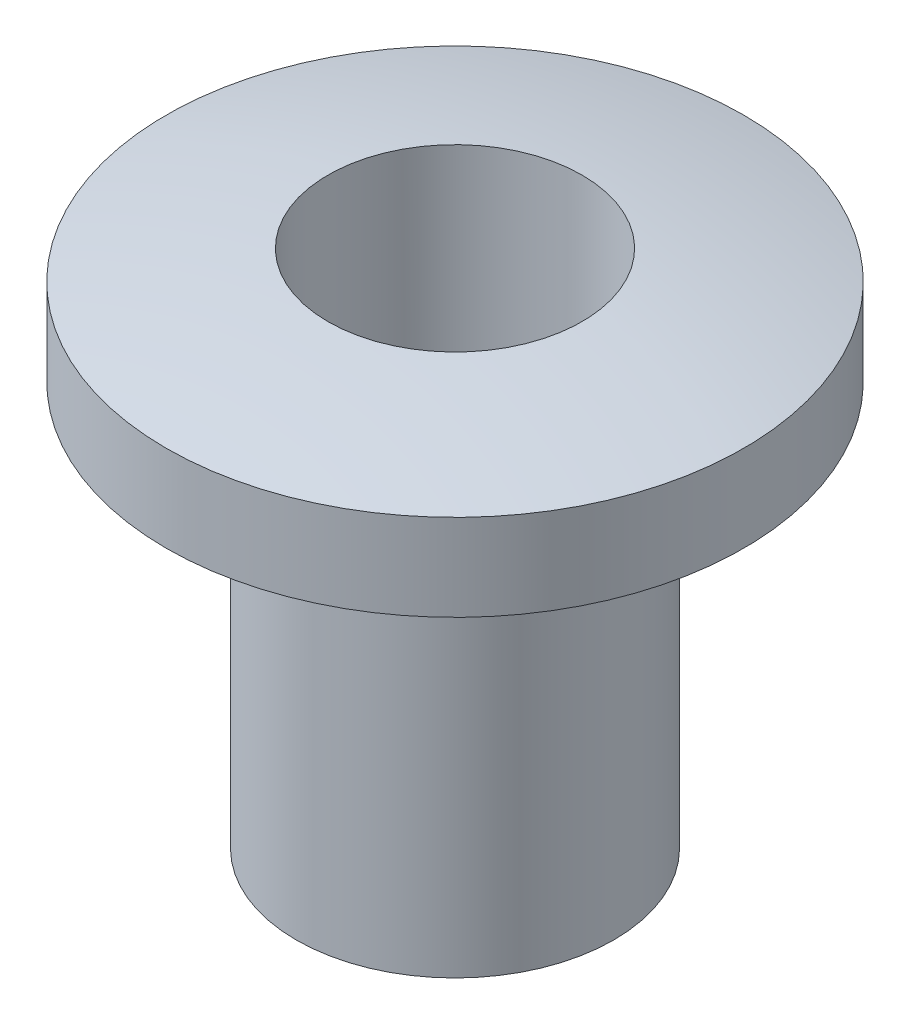
ISO-10303-21;
HEADER;
FILE_DESCRIPTION(('STEP AP214'),'2;1');
FILE_NAME('part.step','',(''),(''),'','','');
FILE_SCHEMA(('AUTOMOTIVE_DESIGN { 1 0 10303 214 1 1 1 1 }'));
ENDSEC;
DATA;
#1=APPLICATION_CONTEXT('core data for automotive mechanical design processes');
#2=APPLICATION_PROTOCOL_DEFINITION('international standard','automotive_design',2000,#1);
#3=PRODUCT_CONTEXT('',#1,'mechanical');
#4=PRODUCT('Part','Part','',(#3));
#5=PRODUCT_RELATED_PRODUCT_CATEGORY('part','',(#4));
#6=PRODUCT_DEFINITION_FORMATION('','',#4);
#7=PRODUCT_DEFINITION_CONTEXT('part definition',#1,'design');
#8=PRODUCT_DEFINITION('design','',#6,#7);
#9=PRODUCT_DEFINITION_SHAPE('','',#8);
#10=(LENGTH_UNIT() NAMED_UNIT(*) SI_UNIT(.MILLI.,.METRE.));
#11=(NAMED_UNIT(*) PLANE_ANGLE_UNIT() SI_UNIT($,.RADIAN.));
#12=(NAMED_UNIT(*) SI_UNIT($,.STERADIAN.) SOLID_ANGLE_UNIT());
#13=UNCERTAINTY_MEASURE_WITH_UNIT(LENGTH_MEASURE(1.E-05),#10,'distance_accuracy_value','');
#14=(GEOMETRIC_REPRESENTATION_CONTEXT(3) GLOBAL_UNCERTAINTY_ASSIGNED_CONTEXT((#13)) GLOBAL_UNIT_ASSIGNED_CONTEXT((#10,
#11,#12)) REPRESENTATION_CONTEXT('',''));
#15=CARTESIAN_POINT('',(0.,0.,0.));
#16=DIRECTION('',(0.,0.,1.));
#17=DIRECTION('',(1.,0.,0.));
#18=AXIS2_PLACEMENT_3D('',#15,#16,#17);
#19=CARTESIAN_POINT('',(0.,0.,-2.75));
#20=DIRECTION('',(0.,1.,0.));
#21=DIRECTION('',(0.,0.,1.));
#22=AXIS2_PLACEMENT_3D('',#19,#20,#21);
#23=PLANE('',#22);
#24=CARTESIAN_POINT('',(0.,0.,0.));
#25=DIRECTION('',(0.,1.,0.));
#26=DIRECTION('',(0.,0.,1.));
#27=AXIS2_PLACEMENT_3D('',#24,#25,#26);
#28=CIRCLE('',#27,2.75);
#29=CARTESIAN_POINT('',(0.,0.,2.75));
#30=VERTEX_POINT('',#29);
#31=EDGE_CURVE('E10',#30,#30,#28,.T.);
#32=ORIENTED_EDGE('',*,*,#31,.F.);
#33=EDGE_LOOP('',(#32));
#34=FACE_BOUND('',#33,.T.);
#35=CARTESIAN_POINT('',(0.,0.,0.));
#36=DIRECTION('',(0.,1.,0.));
#37=DIRECTION('',(0.,0.,1.));
#38=AXIS2_PLACEMENT_3D('',#35,#36,#37);
#39=CIRCLE('',#38,2.2);
#40=CARTESIAN_POINT('',(0.,0.,2.2));
#41=VERTEX_POINT('',#40);
#42=EDGE_CURVE('E53',#41,#41,#39,.T.);
#43=ORIENTED_EDGE('',*,*,#42,.T.);
#44=EDGE_LOOP('',(#43));
#45=FACE_BOUND('',#44,.T.);
#46=ADVANCED_FACE('F31',(#34,#45),#23,.F.);
#47=CARTESIAN_POINT('',(0.,14.1505376344086,0.));
#48=DIRECTION('',(0.,1.,0.));
#49=DIRECTION('',(0.,0.,1.));
#50=AXIS2_PLACEMENT_3D('',#47,#48,#49);
#51=CYLINDRICAL_SURFACE('',#50,2.75);
#52=CARTESIAN_POINT('',(0.,7.,0.));
#53=DIRECTION('',(0.,1.,0.));
#54=DIRECTION('',(0.,0.,1.));
#55=AXIS2_PLACEMENT_3D('',#52,#53,#54);
#56=CIRCLE('',#55,2.75);
#57=CARTESIAN_POINT('',(0.,7.,2.75));
#58=VERTEX_POINT('',#57);
#59=EDGE_CURVE('E37',#58,#58,#56,.T.);
#60=ORIENTED_EDGE('',*,*,#59,.F.);
#61=EDGE_LOOP('',(#60));
#62=FACE_BOUND('',#61,.T.);
#63=ORIENTED_EDGE('',*,*,#31,.T.);
#64=EDGE_LOOP('',(#63));
#65=FACE_BOUND('',#64,.T.);
#66=ADVANCED_FACE('F78',(#62,#65),#51,.T.);
#67=CARTESIAN_POINT('',(0.,7.,-5.));
#68=DIRECTION('',(0.,1.,0.));
#69=DIRECTION('',(0.,0.,1.));
#70=AXIS2_PLACEMENT_3D('',#67,#68,#69);
#71=PLANE('',#70);
#72=CARTESIAN_POINT('',(0.,7.,0.));
#73=DIRECTION('',(0.,1.,0.));
#74=DIRECTION('',(0.,0.,1.));
#75=AXIS2_PLACEMENT_3D('',#72,#73,#74);
#76=CIRCLE('',#75,5.);
#77=CARTESIAN_POINT('',(0.,7.,5.));
#78=VERTEX_POINT('',#77);
#79=EDGE_CURVE('E41',#78,#78,#76,.T.);
#80=ORIENTED_EDGE('',*,*,#79,.F.);
#81=EDGE_LOOP('',(#80));
#82=FACE_BOUND('',#81,.T.);
#83=ORIENTED_EDGE('',*,*,#59,.T.);
#84=EDGE_LOOP('',(#83));
#85=FACE_BOUND('',#84,.T.);
#86=ADVANCED_FACE('F73',(#82,#85),#71,.F.);
#87=CARTESIAN_POINT('',(0.,14.1505376344086,0.));
#88=DIRECTION('',(0.,1.,0.));
#89=DIRECTION('',(0.,0.,1.));
#90=AXIS2_PLACEMENT_3D('',#87,#88,#89);
#91=CYLINDRICAL_SURFACE('',#90,5.);
#92=CARTESIAN_POINT('',(0.,8.5,0.));
#93=DIRECTION('',(0.,1.,0.));
#94=DIRECTION('',(0.,0.,1.));
#95=AXIS2_PLACEMENT_3D('',#92,#93,#94);
#96=CIRCLE('',#95,5.);
#97=CARTESIAN_POINT('',(0.,8.5,-5.00000000000001));
#98=VERTEX_POINT('',#97);
#99=EDGE_CURVE('E45',#98,#98,#96,.T.);
#100=ORIENTED_EDGE('',*,*,#99,.F.);
#101=EDGE_LOOP('',(#100));
#102=FACE_BOUND('',#101,.T.);
#103=ORIENTED_EDGE('',*,*,#79,.T.);
#104=EDGE_LOOP('',(#103));
#105=FACE_BOUND('',#104,.T.);
#106=ADVANCED_FACE('F67',(#102,#105),#91,.T.);
#107=CARTESIAN_POINT('',(0.,-11.41,0.));
#108=DIRECTION('',(0.,1.,0.));
#109=DIRECTION('',(0.,0.,-1.));
#110=AXIS2_PLACEMENT_3D('',#107,#108,#109);
#111=SPHERICAL_SURFACE('',#110,20.5282269083328);
#112=CARTESIAN_POINT('',(0.,9.,0.));
#113=DIRECTION('',(0.,1.,0.));
#114=DIRECTION('',(0.,0.,1.));
#115=AXIS2_PLACEMENT_3D('',#112,#113,#114);
#116=CIRCLE('',#115,2.2);
#117=CARTESIAN_POINT('',(0.,9.,-2.20000000000001));
#118=VERTEX_POINT('',#117);
#119=EDGE_CURVE('E50',#118,#118,#116,.T.);
#120=CARTESIAN_POINT('',(0.,9.,-2.20000000000001));
#121=CARTESIAN_POINT('',(0.,8.99682223180316,-2.22948102626858));
#122=CARTESIAN_POINT('',(0.,8.99358058738778,-2.2589551672972));
#123=CARTESIAN_POINT('',(0.,8.98696960888142,-2.31788912563184));
#124=CARTESIAN_POINT('',(0.,8.98360027479042,-2.34734894293786));
#125=CARTESIAN_POINT('',(0.,8.97673397969426,-2.40625370058459));
#126=CARTESIAN_POINT('',(0.,8.97323701868909,-2.43569864092531));
#127=CARTESIAN_POINT('',(0.,8.96611553556502,-2.49457309175019));
#128=CARTESIAN_POINT('',(0.,8.96249101344612,-2.52400260223435));
#129=CARTESIAN_POINT('',(0.,8.95511447611819,-2.58284564072527));
#130=CARTESIAN_POINT('',(0.,8.95136246090916,-2.61225916873202));
#131=CARTESIAN_POINT('',(0.,8.94373100786469,-2.67106968995257));
#132=CARTESIAN_POINT('',(0.,8.93985157002926,-2.70046668316637));
#133=CARTESIAN_POINT('',(0.,8.93196534457608,-2.75924358279455));
#134=CARTESIAN_POINT('',(0.,8.92795855695833,-2.78862348920893));
#135=CARTESIAN_POINT('',(0.,8.91981770717922,-2.84736566355305));
#136=CARTESIAN_POINT('',(0.,8.91568364501787,-2.87672793148278));
#137=CARTESIAN_POINT('',(0.,8.9072883237793,-2.93543427750348));
#138=CARTESIAN_POINT('',(0.,8.90302706470209,-2.96477835559444));
#139=CARTESIAN_POINT('',(0.,8.89437742964824,-3.02344777092505));
#140=CARTESIAN_POINT('',(0.,8.8899890536716,-3.0527731081647));
#141=CARTESIAN_POINT('',(0.,8.88108526722225,-3.11140449113205));
#142=CARTESIAN_POINT('',(0.,8.87656985674953,-3.14071053685976));
#143=CARTESIAN_POINT('',(0.,8.86741208609676,-3.19930278650484));
#144=CARTESIAN_POINT('',(0.,8.86276972591671,-3.22858899042221));
#145=CARTESIAN_POINT('',(0.,8.85335814302184,-3.28714100652084));
#146=CARTESIAN_POINT('',(0.,8.84858892030703,-3.31640681870209));
#147=CARTESIAN_POINT('',(0.,8.83892370189739,-3.37491750178556));
#148=CARTESIAN_POINT('',(0.,8.83402770620257,-3.40416237268778));
#149=CARTESIAN_POINT('',(0.,8.82410903376815,-3.46263062406354));
#150=CARTESIAN_POINT('',(0.,8.81908635702855,-3.49185400453708));
#151=CARTESIAN_POINT('',(0.,8.80891441681862,-3.55027872630934));
#152=CARTESIAN_POINT('',(0.,8.80376515334828,-3.57948006760806));
#153=CARTESIAN_POINT('',(0.,8.79334013636786,-3.63786016269841));
#154=CARTESIAN_POINT('',(0.,8.78806438285778,-3.66703891649004));
#155=CARTESIAN_POINT('',(0.,8.7773864848641,-3.72537328865805));
#156=CARTESIAN_POINT('',(0.,8.77198434038049,-3.75452890703444));
#157=CARTESIAN_POINT('',(0.,8.76105376187926,-3.81281646089828));
#158=CARTESIAN_POINT('',(0.,8.75552532786165,-3.84194839638572));
#159=CARTESIAN_POINT('',(0.,8.74434227410336,-3.90018803744264));
#160=CARTESIAN_POINT('',(0.,8.73868765436268,-3.92929574301213));
#161=CARTESIAN_POINT('',(0.,8.72725233533869,-3.98748637765912));
#162=CARTESIAN_POINT('',(0.,8.72147163605537,-4.01656930673663));
#163=CARTESIAN_POINT('',(0.,8.70978426649397,-4.07470984229088));
#164=CARTESIAN_POINT('',(0.,8.70387759621589,-4.10376744876763));
#165=CARTESIAN_POINT('',(0.,8.69193839557832,-4.16185679348709));
#166=CARTESIAN_POINT('',(0.,8.68590586521882,-4.1908885317298));
#167=CARTESIAN_POINT('',(0.,8.67371505769508,-4.24892559483365));
#168=CARTESIAN_POINT('',(0.,8.66755678053085,-4.27793091969478));
#169=CARTESIAN_POINT('',(0.,8.65511459503552,-4.33591461138391));
#170=CARTESIAN_POINT('',(0.,8.64883068670443,-4.3648929782119));
#171=CARTESIAN_POINT('',(0.,8.63613735687252,-4.42282220968945));
#172=CARTESIAN_POINT('',(0.,8.62972793537171,-4.451773074339));
#173=CARTESIAN_POINT('',(0.,8.61678369955351,-4.50964675783057));
#174=CARTESIAN_POINT('',(0.,8.61024888523612,-4.53856957667259));
#175=CARTESIAN_POINT('',(0.,8.59705398649569,-4.59638662544743));
#176=CARTESIAN_POINT('',(0.,8.59039390207266,-4.62528085538026));
#177=CARTESIAN_POINT('',(0.,8.57694858817209,-4.68304018376892));
#178=CARTESIAN_POINT('',(0.,8.57016335869456,-4.71190528222475));
#179=CARTESIAN_POINT('',(0.,8.55646788213115,-4.76960580564974));
#180=CARTESIAN_POINT('',(0.,8.54955763504527,-4.79844123061891));
#181=CARTESIAN_POINT('',(0.,8.53561225289064,-4.85608186557663));
#182=CARTESIAN_POINT('',(0.,8.52857711782189,-4.88488707556519));
#183=CARTESIAN_POINT('',(0.,8.51438209229981,-4.94246673978988));
#184=CARTESIAN_POINT('',(0.,8.50722220184648,-4.97124119402601));
#185=CARTESIAN_POINT('',(0.,8.5,-5.00000000000001));
#186=B_SPLINE_CURVE_WITH_KNOTS('',3,(#120,#121,#122,#123,#124,#125,#126,#127,#128,#129,#130,
#131,#132,#133,#134,#135,#136,#137,#138,#139,#140,#141,#142,#143,#144,#145,#146,#147,#148,#149,
#150,#151,#152,#153,#154,#155,#156,#157,#158,#159,#160,#161,#162,#163,#164,#165,#166,#167,#168,
#169,#170,#171,#172,#173,#174,#175,#176,#177,#178,#179,#180,#181,#182,#183,#184,#185),
.UNSPECIFIED.,.F.,.F.,(4,2,2,2,2,2,2,2,2,2,2,2,2,2,2,2,2,2,2,2,2,2,2,2,2,2,2,2,2,2,2,2,4),(0.,
0.0889553241896388,0.177910648379282,0.266865972568922,0.355821296758565,0.444776620948204,
0.533731945137844,0.622687269327487,0.711642593517126,0.800597917706765,0.889553241896408,
0.978508566086048,1.06746389027569,1.15641921446533,1.24537453865497,1.33432986284461,
1.42328518703425,1.51224051122389,1.60119583541353,1.69015115960317,1.77910648379282,
1.86806180798246,1.9570171321721,2.04597245636174,2.13492778055138,2.22388310474102,
2.31283842893066,2.4017937531203,2.49074907730994,2.57970440149958,2.66865972568922,
2.75761504987886,2.8465703740685),.UNSPECIFIED.);
#187=EDGE_CURVE('BSEAM61',#118,#98,#186,.T.);
#188=ORIENTED_EDGE('',*,*,#119,.F.);
#189=ORIENTED_EDGE('',*,*,#99,.T.);
#190=ORIENTED_EDGE('',*,*,#187,.T.);
#191=ORIENTED_EDGE('',*,*,#187,.F.);
#192=EDGE_LOOP('',(#188,#190,#189,#191));
#193=FACE_BOUND('',#192,.T.);
#194=ADVANCED_FACE('F61',(#193),#111,.T.);
#195=CARTESIAN_POINT('',(0.,14.1505376344086,0.));
#196=DIRECTION('',(0.,1.,0.));
#197=DIRECTION('',(0.,0.,1.));
#198=AXIS2_PLACEMENT_3D('',#195,#196,#197);
#199=CYLINDRICAL_SURFACE('',#198,2.2);
#200=ORIENTED_EDGE('',*,*,#42,.F.);
#201=EDGE_LOOP('',(#200));
#202=FACE_BOUND('',#201,.T.);
#203=ORIENTED_EDGE('',*,*,#119,.T.);
#204=EDGE_LOOP('',(#203));
#205=FACE_BOUND('',#204,.T.);
#206=ADVANCED_FACE('F58',(#202,#205),#199,.F.);
#207=CLOSED_SHELL('',(#46,#66,#86,#106,#194,#206));
#208=MANIFOLD_SOLID_BREP('B2',#207);
#209=ADVANCED_BREP_SHAPE_REPRESENTATION('',(#18,#208),#14);
#210=SHAPE_DEFINITION_REPRESENTATION(#9,#209);
ENDSEC;
END-ISO-10303-21;
